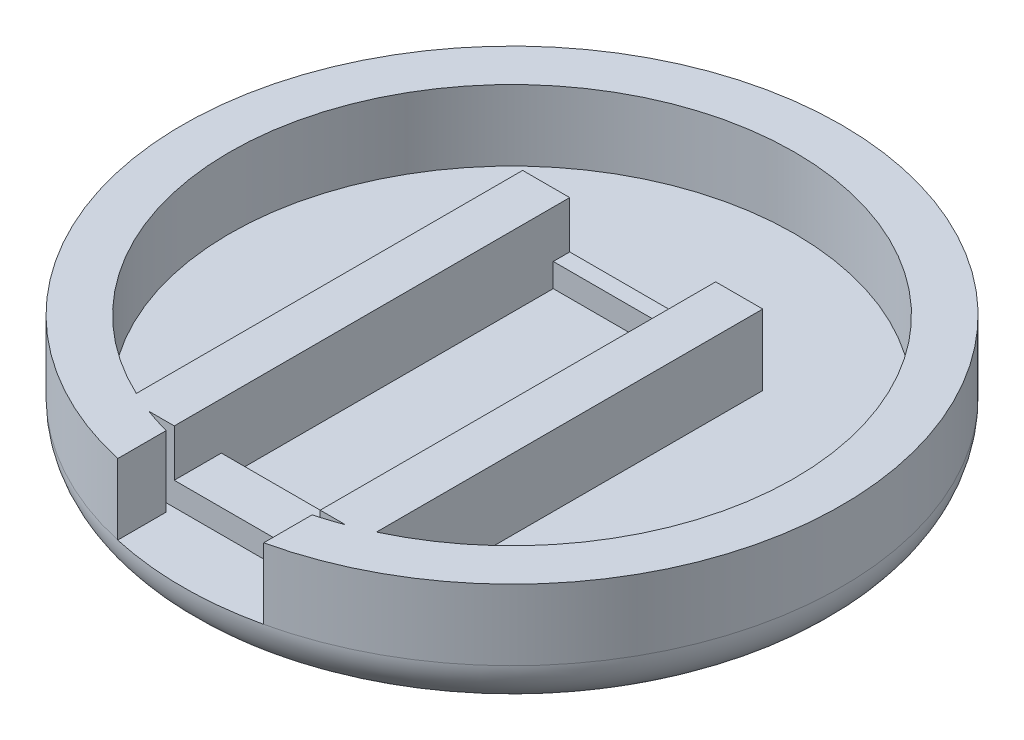
ISO-10303-21;
HEADER;
FILE_DESCRIPTION(('STEP AP214'),'2;1');
FILE_NAME('part.step','',(''),(''),'','','');
FILE_SCHEMA(('AUTOMOTIVE_DESIGN { 1 0 10303 214 1 1 1 1 }'));
ENDSEC;
DATA;
#1=APPLICATION_CONTEXT('core data for automotive mechanical design processes');
#2=APPLICATION_PROTOCOL_DEFINITION('international standard','automotive_design',2000,#1);
#3=PRODUCT_CONTEXT('',#1,'mechanical');
#4=PRODUCT('Part','Part','',(#3));
#5=PRODUCT_RELATED_PRODUCT_CATEGORY('part','',(#4));
#6=PRODUCT_DEFINITION_FORMATION('','',#4);
#7=PRODUCT_DEFINITION_CONTEXT('part definition',#1,'design');
#8=PRODUCT_DEFINITION('design','',#6,#7);
#9=PRODUCT_DEFINITION_SHAPE('','',#8);
#10=(LENGTH_UNIT() NAMED_UNIT(*) SI_UNIT(.MILLI.,.METRE.));
#11=(NAMED_UNIT(*) PLANE_ANGLE_UNIT() SI_UNIT($,.RADIAN.));
#12=(NAMED_UNIT(*) SI_UNIT($,.STERADIAN.) SOLID_ANGLE_UNIT());
#13=UNCERTAINTY_MEASURE_WITH_UNIT(LENGTH_MEASURE(1.E-05),#10,'distance_accuracy_value','');
#14=(GEOMETRIC_REPRESENTATION_CONTEXT(3) GLOBAL_UNCERTAINTY_ASSIGNED_CONTEXT((#13)) GLOBAL_UNIT_ASSIGNED_CONTEXT((#10,
#11,#12)) REPRESENTATION_CONTEXT('',''));
#15=CARTESIAN_POINT('',(0.,0.,0.));
#16=DIRECTION('',(0.,0.,1.));
#17=DIRECTION('',(1.,0.,0.));
#18=AXIS2_PLACEMENT_3D('',#15,#16,#17);
#19=CARTESIAN_POINT('',(-29.6271495714285,42.5979797464467,3.22224528571427));
#20=DIRECTION('',(0.,-1.,0.));
#21=DIRECTION('',(0.,0.,-1.));
#22=AXIS2_PLACEMENT_3D('',#19,#20,#21);
#23=CYLINDRICAL_SURFACE('',#22,12.);
#24=DIRECTION('',(0.,-1.,0.));
#25=VECTOR('',#24,1.);
#26=CARTESIAN_POINT('',(-32.7271495714285,42.5979797464467,14.8149153836684));
#27=LINE('',#26,#25);
#28=CARTESIAN_POINT('',(-32.7271495714285,0.,14.8149153836684));
#29=VERTEX_POINT('',#28);
#30=CARTESIAN_POINT('',(-32.7271495714285,3.,14.8149153836684));
#31=VERTEX_POINT('',#30);
#32=EDGE_CURVE('E333',#29,#31,#27,.F.);
#33=ORIENTED_EDGE('',*,*,#32,.F.);
#34=CARTESIAN_POINT('',(-29.6271495714285,0.,3.22224528571427));
#35=DIRECTION('',(0.,-1.,0.));
#36=DIRECTION('',(0.,0.,-1.));
#37=AXIS2_PLACEMENT_3D('',#34,#35,#36);
#38=CIRCLE('',#37,12.);
#39=CARTESIAN_POINT('',(-33.8038887163118,0.,14.4719052857143));
#40=VERTEX_POINT('',#39);
#41=EDGE_CURVE('E329',#40,#29,#38,.F.);
#42=ORIENTED_EDGE('',*,*,#41,.F.);
#43=DIRECTION('',(0.,-1.,0.));
#44=VECTOR('',#43,1.);
#45=CARTESIAN_POINT('',(-33.8038887163118,42.5979797464467,14.4719052857143));
#46=LINE('',#45,#44);
#47=CARTESIAN_POINT('',(-33.8038887163118,3.,14.4719052857143));
#48=VERTEX_POINT('',#47);
#49=EDGE_CURVE('E194',#40,#48,#46,.F.);
#50=ORIENTED_EDGE('',*,*,#49,.T.);
#51=CARTESIAN_POINT('',(-29.6271495714285,3.,3.22224528571427));
#52=DIRECTION('',(0.,-1.,0.));
#53=DIRECTION('',(0.,0.,-1.));
#54=AXIS2_PLACEMENT_3D('',#51,#52,#53);
#55=CIRCLE('',#54,12.);
#56=EDGE_CURVE('E187',#48,#31,#55,.F.);
#57=ORIENTED_EDGE('',*,*,#56,.T.);
#58=EDGE_LOOP('',(#33,#42,#50,#57));
#59=FACE_BOUND('',#58,.T.);
#60=ADVANCED_FACE('F33',(#59),#23,.F.);
#61=DIRECTION('',(0.,-1.,0.));
#62=VECTOR('',#61,1.);
#63=CARTESIAN_POINT('',(-26.5271495714285,42.5979797464467,14.8149153836684));
#64=LINE('',#63,#62);
#65=CARTESIAN_POINT('',(-26.5271495714285,3.,14.8149153836684));
#66=VERTEX_POINT('',#65);
#67=CARTESIAN_POINT('',(-26.5271495714285,0.,14.8149153836684));
#68=VERTEX_POINT('',#67);
#69=EDGE_CURVE('E167',#66,#68,#64,.T.);
#70=ORIENTED_EDGE('',*,*,#69,.F.);
#71=CARTESIAN_POINT('',(-25.4504104265453,3.,14.4719052857143));
#72=VERTEX_POINT('',#71);
#73=EDGE_CURVE('E177',#66,#72,#55,.F.);
#74=ORIENTED_EDGE('',*,*,#73,.T.);
#75=DIRECTION('',(0.,-1.,0.));
#76=VECTOR('',#75,1.);
#77=CARTESIAN_POINT('',(-25.4504104265453,42.5979797464467,14.4719052857143));
#78=LINE('',#77,#76);
#79=CARTESIAN_POINT('',(-25.4504104265453,0.,14.4719052857143));
#80=VERTEX_POINT('',#79);
#81=EDGE_CURVE('E196',#72,#80,#78,.T.);
#82=ORIENTED_EDGE('',*,*,#81,.T.);
#83=EDGE_CURVE('E332',#68,#80,#38,.F.);
#84=ORIENTED_EDGE('',*,*,#83,.F.);
#85=EDGE_LOOP('',(#70,#74,#82,#84));
#86=FACE_BOUND('',#85,.T.);
#87=ADVANCED_FACE('F285',(#86),#23,.F.);
#88=CARTESIAN_POINT('',(0.,3.,0.));
#89=DIRECTION('',(0.,-1.,0.));
#90=DIRECTION('',(0.,0.,-1.));
#91=AXIS2_PLACEMENT_3D('',#88,#89,#90);
#92=PLANE('',#91);
#93=DIRECTION('',(0.,0.,-1.));
#94=VECTOR('',#93,1.);
#95=CARTESIAN_POINT('',(-32.7271495714285,3.,22.0919052857143));
#96=LINE('',#95,#94);
#97=CARTESIAN_POINT('',(-32.7271495714285,3.,16.8747175892936));
#98=VERTEX_POINT('',#97);
#99=EDGE_CURVE('E178',#98,#31,#96,.T.);
#100=ORIENTED_EDGE('',*,*,#99,.T.);
#101=ORIENTED_EDGE('',*,*,#56,.F.);
#102=DIRECTION('',(1.,0.,0.));
#103=VECTOR('',#102,1.);
#104=CARTESIAN_POINT('',(-24.5271495714285,3.,14.4719052857143));
#105=LINE('',#104,#103);
#106=CARTESIAN_POINT('',(-32.7271495714285,3.,14.4719052857143));
#107=VERTEX_POINT('',#106);
#108=EDGE_CURVE('E259',#48,#107,#105,.T.);
#109=ORIENTED_EDGE('',*,*,#108,.T.);
#110=DIRECTION('',(0.,0.,1.));
#111=VECTOR('',#110,1.);
#112=CARTESIAN_POINT('',(-32.7271495714285,3.,-1.62809471428573));
#113=LINE('',#112,#111);
#114=CARTESIAN_POINT('',(-32.7271495714285,3.,-2.32809471428573));
#115=VERTEX_POINT('',#114);
#116=EDGE_CURVE('E230',#115,#107,#113,.T.);
#117=ORIENTED_EDGE('',*,*,#116,.F.);
#118=DIRECTION('',(-1.,0.,0.));
#119=VECTOR('',#118,1.);
#120=CARTESIAN_POINT('',(-34.7271495714285,3.,-2.32809471428573));
#121=LINE('',#120,#119);
#122=CARTESIAN_POINT('',(-34.7271495714285,3.,-2.32809471428573));
#123=VERTEX_POINT('',#122);
#124=EDGE_CURVE('E263',#115,#123,#121,.T.);
#125=ORIENTED_EDGE('',*,*,#124,.T.);
#126=DIRECTION('',(0.,0.,1.));
#127=VECTOR('',#126,1.);
#128=CARTESIAN_POINT('',(-34.7271495714285,3.,14.4719052857143));
#129=LINE('',#128,#127);
#130=CARTESIAN_POINT('',(-34.7271495714285,3.,14.0845654798533));
#131=VERTEX_POINT('',#130);
#132=EDGE_CURVE('E255',#123,#131,#129,.T.);
#133=ORIENTED_EDGE('',*,*,#132,.T.);
#134=CARTESIAN_POINT('',(-24.5271495714285,3.,14.0845654798533));
#135=VERTEX_POINT('',#134);
#136=EDGE_CURVE('E184',#135,#131,#55,.F.);
#137=ORIENTED_EDGE('',*,*,#136,.F.);
#138=DIRECTION('',(0.,0.,-1.));
#139=VECTOR('',#138,1.);
#140=CARTESIAN_POINT('',(-24.5271495714285,3.,-2.32809471428573));
#141=LINE('',#140,#139);
#142=CARTESIAN_POINT('',(-24.5271495714285,3.,-2.32809471428573));
#143=VERTEX_POINT('',#142);
#144=EDGE_CURVE('E261',#135,#143,#141,.T.);
#145=ORIENTED_EDGE('',*,*,#144,.T.);
#146=CARTESIAN_POINT('',(-26.5271495714285,3.,-2.32809471428573));
#147=VERTEX_POINT('',#146);
#148=EDGE_CURVE('E264',#143,#147,#121,.T.);
#149=ORIENTED_EDGE('',*,*,#148,.T.);
#150=DIRECTION('',(0.,0.,-1.));
#151=VECTOR('',#150,1.);
#152=CARTESIAN_POINT('',(-26.5271495714285,3.,12.4719052857143));
#153=LINE('',#152,#151);
#154=CARTESIAN_POINT('',(-26.5271495714285,3.,14.4719052857143));
#155=VERTEX_POINT('',#154);
#156=EDGE_CURVE('E233',#155,#147,#153,.T.);
#157=ORIENTED_EDGE('',*,*,#156,.F.);
#158=EDGE_CURVE('E258',#155,#72,#105,.T.);
#159=ORIENTED_EDGE('',*,*,#158,.T.);
#160=ORIENTED_EDGE('',*,*,#73,.F.);
#161=DIRECTION('',(0.,0.,-1.));
#162=VECTOR('',#161,1.);
#163=CARTESIAN_POINT('',(-26.5271495714285,3.,22.0919052857143));
#164=LINE('',#163,#162);
#165=CARTESIAN_POINT('',(-26.5271495714285,3.,16.8747175892936));
#166=VERTEX_POINT('',#165);
#167=EDGE_CURVE('E160',#166,#66,#164,.T.);
#168=ORIENTED_EDGE('',*,*,#167,.F.);
#169=CARTESIAN_POINT('',(-29.6271495714285,3.,3.22224528571427));
#170=DIRECTION('',(0.,-1.,0.));
#171=DIRECTION('',(0.,0.,-1.));
#172=AXIS2_PLACEMENT_3D('',#169,#170,#171);
#173=CIRCLE('',#172,14.);
#174=EDGE_CURVE('E175',#166,#98,#173,.F.);
#175=ORIENTED_EDGE('',*,*,#174,.T.);
#176=EDGE_LOOP('',(#100,#101,#109,#117,#125,#133,#137,#145,#149,#157,#159,#160,#168,#175));
#177=FACE_BOUND('',#176,.T.);
#178=ADVANCED_FACE('F174',(#177),#92,.F.);
#179=CARTESIAN_POINT('',(-29.6271495714285,42.5979797464467,3.22224528571427));
#180=DIRECTION('',(0.,-1.,0.));
#181=DIRECTION('',(0.,0.,-1.));
#182=AXIS2_PLACEMENT_3D('',#179,#180,#181);
#183=CYLINDRICAL_SURFACE('',#182,14.);
#184=DIRECTION('',(0.,-1.,0.));
#185=VECTOR('',#184,1.);
#186=CARTESIAN_POINT('',(-26.5271495714285,42.5979797464467,16.8747175892936));
#187=LINE('',#186,#185);
#188=CARTESIAN_POINT('',(-26.5271495714285,0.,16.8747175892936));
#189=VERTEX_POINT('',#188);
#190=EDGE_CURVE('E157',#166,#189,#187,.T.);
#191=ORIENTED_EDGE('',*,*,#190,.T.);
#192=CARTESIAN_POINT('',(-29.6271495714285,0.,3.22224528571427));
#193=DIRECTION('',(0.,-1.,0.));
#194=DIRECTION('',(0.,0.,-1.));
#195=AXIS2_PLACEMENT_3D('',#192,#193,#194);
#196=CIRCLE('',#195,14.);
#197=CARTESIAN_POINT('',(-32.7271495714285,0.,16.8747175892936));
#198=VERTEX_POINT('',#197);
#199=EDGE_CURVE('E11',#189,#198,#196,.F.);
#200=ORIENTED_EDGE('',*,*,#199,.T.);
#201=DIRECTION('',(0.,-1.,0.));
#202=VECTOR('',#201,1.);
#203=CARTESIAN_POINT('',(-32.7271495714285,42.5979797464467,16.8747175892936));
#204=LINE('',#203,#202);
#205=EDGE_CURVE('E183',#198,#98,#204,.F.);
#206=ORIENTED_EDGE('',*,*,#205,.T.);
#207=ORIENTED_EDGE('',*,*,#174,.F.);
#208=EDGE_LOOP('',(#191,#200,#206,#207));
#209=FACE_BOUND('',#208,.T.);
#210=ADVANCED_FACE('F181',(#209),#183,.T.);
#211=CARTESIAN_POINT('',(-34.7271495714285,3.,14.4719052857143));
#212=DIRECTION('',(1.,0.,0.));
#213=DIRECTION('',(0.,0.,-1.));
#214=AXIS2_PLACEMENT_3D('',#211,#212,#213);
#215=PLANE('',#214);
#216=DIRECTION('',(0.,0.,-1.));
#217=VECTOR('',#216,1.);
#218=CARTESIAN_POINT('',(-34.7271495714285,0.,14.4719052857143));
#219=LINE('',#218,#217);
#220=CARTESIAN_POINT('',(-34.7271495714285,0.,14.0845654798533));
#221=VERTEX_POINT('',#220);
#222=CARTESIAN_POINT('',(-34.7271495714285,0.,-2.32809471428573));
#223=VERTEX_POINT('',#222);
#224=EDGE_CURVE('E188',#221,#223,#219,.T.);
#225=ORIENTED_EDGE('',*,*,#224,.F.);
#226=DIRECTION('',(0.,-1.,0.));
#227=VECTOR('',#226,1.);
#228=CARTESIAN_POINT('',(-34.7271495714285,42.5979797464467,14.0845654798533));
#229=LINE('',#228,#227);
#230=EDGE_CURVE('E199',#131,#221,#229,.T.);
#231=ORIENTED_EDGE('',*,*,#230,.F.);
#232=ORIENTED_EDGE('',*,*,#132,.F.);
#233=DIRECTION('',(0.,-1.,0.));
#234=VECTOR('',#233,1.);
#235=CARTESIAN_POINT('',(-34.7271495714285,3.,-2.32809471428573));
#236=LINE('',#235,#234);
#237=EDGE_CURVE('E267',#123,#223,#236,.T.);
#238=ORIENTED_EDGE('',*,*,#237,.T.);
#239=EDGE_LOOP('',(#225,#231,#232,#238));
#240=FACE_BOUND('',#239,.T.);
#241=ADVANCED_FACE('F370',(#240),#215,.F.);
#242=CARTESIAN_POINT('',(-24.5271495714285,3.,14.4719052857143));
#243=DIRECTION('',(0.,0.,-1.));
#244=DIRECTION('',(-1.,0.,0.));
#245=AXIS2_PLACEMENT_3D('',#242,#243,#244);
#246=PLANE('',#245);
#247=DIRECTION('',(1.,0.,0.));
#248=VECTOR('',#247,1.);
#249=CARTESIAN_POINT('',(-32.7271495714285,1.,14.4719052857143));
#250=LINE('',#249,#248);
#251=CARTESIAN_POINT('',(-32.7271495714285,1.,14.4719052857143));
#252=VERTEX_POINT('',#251);
#253=CARTESIAN_POINT('',(-26.5271495714285,1.,14.4719052857143));
#254=VERTEX_POINT('',#253);
#255=EDGE_CURVE('E204',#252,#254,#250,.T.);
#256=ORIENTED_EDGE('',*,*,#255,.F.);
#257=DIRECTION('',(0.,-1.,0.));
#258=VECTOR('',#257,1.);
#259=CARTESIAN_POINT('',(-32.7271495714285,3.,14.4719052857143));
#260=LINE('',#259,#258);
#261=EDGE_CURVE('E201',#107,#252,#260,.T.);
#262=ORIENTED_EDGE('',*,*,#261,.F.);
#263=ORIENTED_EDGE('',*,*,#108,.F.);
#264=ORIENTED_EDGE('',*,*,#49,.F.);
#265=DIRECTION('',(-1.,0.,0.));
#266=VECTOR('',#265,1.);
#267=CARTESIAN_POINT('',(-24.5271495714285,0.,14.4719052857143));
#268=LINE('',#267,#266);
#269=EDGE_CURVE('E320',#80,#40,#268,.T.);
#270=ORIENTED_EDGE('',*,*,#269,.F.);
#271=ORIENTED_EDGE('',*,*,#81,.F.);
#272=ORIENTED_EDGE('',*,*,#158,.F.);
#273=DIRECTION('',(0.,1.,0.));
#274=VECTOR('',#273,1.);
#275=CARTESIAN_POINT('',(-26.5271495714285,3.,14.4719052857143));
#276=LINE('',#275,#274);
#277=EDGE_CURVE('E207',#254,#155,#276,.T.);
#278=ORIENTED_EDGE('',*,*,#277,.F.);
#279=EDGE_LOOP('',(#256,#262,#263,#264,#270,#271,#272,#278));
#280=FACE_BOUND('',#279,.T.);
#281=ADVANCED_FACE('F351',(#280),#246,.F.);
#282=CARTESIAN_POINT('',(-24.5271495714285,3.,-2.32809471428573));
#283=DIRECTION('',(-1.,0.,0.));
#284=DIRECTION('',(0.,0.,1.));
#285=AXIS2_PLACEMENT_3D('',#282,#283,#284);
#286=PLANE('',#285);
#287=DIRECTION('',(0.,0.,1.));
#288=VECTOR('',#287,1.);
#289=CARTESIAN_POINT('',(-24.5271495714285,0.,-2.32809471428573));
#290=LINE('',#289,#288);
#291=CARTESIAN_POINT('',(-24.5271495714285,0.,-2.32809471428573));
#292=VERTEX_POINT('',#291);
#293=CARTESIAN_POINT('',(-24.5271495714285,0.,14.0845654798533));
#294=VERTEX_POINT('',#293);
#295=EDGE_CURVE('E319',#292,#294,#290,.T.);
#296=ORIENTED_EDGE('',*,*,#295,.F.);
#297=DIRECTION('',(0.,-1.,0.));
#298=VECTOR('',#297,1.);
#299=CARTESIAN_POINT('',(-24.5271495714285,3.,-2.32809471428573));
#300=LINE('',#299,#298);
#301=EDGE_CURVE('E269',#143,#292,#300,.T.);
#302=ORIENTED_EDGE('',*,*,#301,.F.);
#303=ORIENTED_EDGE('',*,*,#144,.F.);
#304=DIRECTION('',(0.,-1.,0.));
#305=VECTOR('',#304,1.);
#306=CARTESIAN_POINT('',(-24.5271495714285,42.5979797464467,14.0845654798533));
#307=LINE('',#306,#305);
#308=EDGE_CURVE('E192',#294,#135,#307,.F.);
#309=ORIENTED_EDGE('',*,*,#308,.F.);
#310=EDGE_LOOP('',(#296,#302,#303,#309));
#311=FACE_BOUND('',#310,.T.);
#312=ADVANCED_FACE('F308',(#311),#286,.F.);
#313=CARTESIAN_POINT('',(-34.7271495714285,3.,-2.32809471428573));
#314=DIRECTION('',(0.,0.,1.));
#315=DIRECTION('',(1.,0.,0.));
#316=AXIS2_PLACEMENT_3D('',#313,#314,#315);
#317=PLANE('',#316);
#318=DIRECTION('',(1.,0.,0.));
#319=VECTOR('',#318,1.);
#320=CARTESIAN_POINT('',(-34.7271495714285,0.,-2.32809471428573));
#321=LINE('',#320,#319);
#322=EDGE_CURVE('E53',#223,#292,#321,.T.);
#323=ORIENTED_EDGE('',*,*,#322,.F.);
#324=ORIENTED_EDGE('',*,*,#237,.F.);
#325=ORIENTED_EDGE('',*,*,#124,.F.);
#326=DIRECTION('',(0.,-1.,0.));
#327=VECTOR('',#326,1.);
#328=CARTESIAN_POINT('',(-32.7271495714285,3.,-2.32809471428573));
#329=LINE('',#328,#327);
#330=CARTESIAN_POINT('',(-32.7271495714285,1.,-2.32809471428573));
#331=VERTEX_POINT('',#330);
#332=EDGE_CURVE('E226',#115,#331,#329,.T.);
#333=ORIENTED_EDGE('',*,*,#332,.T.);
#334=DIRECTION('',(1.,0.,0.));
#335=VECTOR('',#334,1.);
#336=CARTESIAN_POINT('',(-34.7271495714285,1.,-2.32809471428573));
#337=LINE('',#336,#335);
#338=CARTESIAN_POINT('',(-26.5271495714285,1.,-2.32809471428573));
#339=VERTEX_POINT('',#338);
#340=EDGE_CURVE('E220',#331,#339,#337,.T.);
#341=ORIENTED_EDGE('',*,*,#340,.T.);
#342=DIRECTION('',(0.,1.,0.));
#343=VECTOR('',#342,1.);
#344=CARTESIAN_POINT('',(-26.5271495714285,3.,-2.32809471428573));
#345=LINE('',#344,#343);
#346=EDGE_CURVE('E223',#339,#147,#345,.T.);
#347=ORIENTED_EDGE('',*,*,#346,.T.);
#348=ORIENTED_EDGE('',*,*,#148,.F.);
#349=ORIENTED_EDGE('',*,*,#301,.T.);
#350=EDGE_LOOP('',(#323,#324,#325,#333,#341,#347,#348,#349));
#351=FACE_BOUND('',#350,.T.);
#352=ADVANCED_FACE('F299',(#351),#317,.F.);
#353=CARTESIAN_POINT('',(-29.6271495714285,0.,3.22224528571427));
#354=DIRECTION('',(0.,-1.,0.));
#355=DIRECTION('',(0.,0.,-1.));
#356=AXIS2_PLACEMENT_3D('',#353,#354,#355);
#357=CIRCLE('',#356,12.);
#358=EDGE_CURVE('E311',#294,#221,#357,.F.);
#359=ORIENTED_EDGE('',*,*,#358,.F.);
#360=ORIENTED_EDGE('',*,*,#308,.T.);
#361=ORIENTED_EDGE('',*,*,#136,.T.);
#362=ORIENTED_EDGE('',*,*,#230,.T.);
#363=EDGE_LOOP('',(#359,#360,#361,#362));
#364=FACE_BOUND('',#363,.T.);
#365=ADVANCED_FACE('F288',(#364),#23,.F.);
#366=CARTESIAN_POINT('',(-26.5271495714285,3.,-1.62809471428573));
#367=DIRECTION('',(0.,0.,1.));
#368=DIRECTION('',(1.,0.,0.));
#369=AXIS2_PLACEMENT_3D('',#366,#367,#368);
#370=PLANE('',#369);
#371=DIRECTION('',(1.,0.,0.));
#372=VECTOR('',#371,1.);
#373=CARTESIAN_POINT('',(-26.5271495714285,1.,-1.62809471428573));
#374=LINE('',#373,#372);
#375=CARTESIAN_POINT('',(-32.7271495714285,1.,-1.62809471428573));
#376=VERTEX_POINT('',#375);
#377=CARTESIAN_POINT('',(-26.5271495714285,1.,-1.62809471428573));
#378=VERTEX_POINT('',#377);
#379=EDGE_CURVE('E218',#376,#378,#374,.T.);
#380=ORIENTED_EDGE('',*,*,#379,.F.);
#381=DIRECTION('',(0.,-1.,0.));
#382=VECTOR('',#381,1.);
#383=CARTESIAN_POINT('',(-32.7271495714285,3.,-1.62809471428573));
#384=LINE('',#383,#382);
#385=CARTESIAN_POINT('',(-32.7271495714285,0.,-1.62809471428573));
#386=VERTEX_POINT('',#385);
#387=EDGE_CURVE('E253',#376,#386,#384,.T.);
#388=ORIENTED_EDGE('',*,*,#387,.T.);
#389=DIRECTION('',(-1.,0.,0.));
#390=VECTOR('',#389,1.);
#391=CARTESIAN_POINT('',(-26.5271495714285,0.,-1.62809471428573));
#392=LINE('',#391,#390);
#393=CARTESIAN_POINT('',(-26.5271495714285,0.,-1.62809471428573));
#394=VERTEX_POINT('',#393);
#395=EDGE_CURVE('E229',#394,#386,#392,.T.);
#396=ORIENTED_EDGE('',*,*,#395,.F.);
#397=DIRECTION('',(0.,-1.,0.));
#398=VECTOR('',#397,1.);
#399=CARTESIAN_POINT('',(-26.5271495714285,3.,-1.62809471428573));
#400=LINE('',#399,#398);
#401=EDGE_CURVE('E236',#378,#394,#400,.T.);
#402=ORIENTED_EDGE('',*,*,#401,.F.);
#403=EDGE_LOOP('',(#380,#388,#396,#402));
#404=FACE_BOUND('',#403,.T.);
#405=ADVANCED_FACE('F298',(#404),#370,.T.);
#406=CARTESIAN_POINT('',(-32.7271495714285,3.,-1.62809471428573));
#407=DIRECTION('',(1.,0.,0.));
#408=DIRECTION('',(0.,0.,-1.));
#409=AXIS2_PLACEMENT_3D('',#406,#407,#408);
#410=PLANE('',#409);
#411=ORIENTED_EDGE('',*,*,#387,.F.);
#412=DIRECTION('',(0.,0.,1.));
#413=VECTOR('',#412,1.);
#414=CARTESIAN_POINT('',(-32.7271495714285,1.,-10.9280947142857));
#415=LINE('',#414,#413);
#416=EDGE_CURVE('E214',#331,#376,#415,.T.);
#417=ORIENTED_EDGE('',*,*,#416,.F.);
#418=ORIENTED_EDGE('',*,*,#332,.F.);
#419=ORIENTED_EDGE('',*,*,#116,.T.);
#420=ORIENTED_EDGE('',*,*,#261,.T.);
#421=CARTESIAN_POINT('',(-32.7271495714285,1.,12.4719052857143));
#422=VERTEX_POINT('',#421);
#423=EDGE_CURVE('E210',#422,#252,#415,.T.);
#424=ORIENTED_EDGE('',*,*,#423,.F.);
#425=DIRECTION('',(0.,-1.,0.));
#426=VECTOR('',#425,1.);
#427=CARTESIAN_POINT('',(-32.7271495714285,3.,12.4719052857143));
#428=LINE('',#427,#426);
#429=CARTESIAN_POINT('',(-32.7271495714285,0.,12.4719052857143));
#430=VERTEX_POINT('',#429);
#431=EDGE_CURVE('E251',#422,#430,#428,.T.);
#432=ORIENTED_EDGE('',*,*,#431,.T.);
#433=DIRECTION('',(0.,0.,1.));
#434=VECTOR('',#433,1.);
#435=CARTESIAN_POINT('',(-32.7271495714285,0.,-1.62809471428573));
#436=LINE('',#435,#434);
#437=EDGE_CURVE('E239',#386,#430,#436,.T.);
#438=ORIENTED_EDGE('',*,*,#437,.F.);
#439=EDGE_LOOP('',(#411,#417,#418,#419,#420,#424,#432,#438));
#440=FACE_BOUND('',#439,.T.);
#441=ADVANCED_FACE('F305',(#440),#410,.T.);
#442=CARTESIAN_POINT('',(-32.7271495714285,3.,12.4719052857143));
#443=DIRECTION('',(0.,0.,-1.));
#444=DIRECTION('',(-1.,0.,0.));
#445=AXIS2_PLACEMENT_3D('',#442,#443,#444);
#446=PLANE('',#445);
#447=DIRECTION('',(-1.,0.,0.));
#448=VECTOR('',#447,1.);
#449=CARTESIAN_POINT('',(-32.7271495714285,1.,12.4719052857143));
#450=LINE('',#449,#448);
#451=CARTESIAN_POINT('',(-26.5271495714285,1.,12.4719052857143));
#452=VERTEX_POINT('',#451);
#453=EDGE_CURVE('E216',#452,#422,#450,.T.);
#454=ORIENTED_EDGE('',*,*,#453,.F.);
#455=DIRECTION('',(0.,-1.,0.));
#456=VECTOR('',#455,1.);
#457=CARTESIAN_POINT('',(-26.5271495714285,3.,12.4719052857143));
#458=LINE('',#457,#456);
#459=CARTESIAN_POINT('',(-26.5271495714285,0.,12.4719052857143));
#460=VERTEX_POINT('',#459);
#461=EDGE_CURVE('E248',#452,#460,#458,.T.);
#462=ORIENTED_EDGE('',*,*,#461,.T.);
#463=DIRECTION('',(1.,0.,0.));
#464=VECTOR('',#463,1.);
#465=CARTESIAN_POINT('',(-32.7271495714285,0.,12.4719052857143));
#466=LINE('',#465,#464);
#467=EDGE_CURVE('E242',#430,#460,#466,.T.);
#468=ORIENTED_EDGE('',*,*,#467,.F.);
#469=ORIENTED_EDGE('',*,*,#431,.F.);
#470=EDGE_LOOP('',(#454,#462,#468,#469));
#471=FACE_BOUND('',#470,.T.);
#472=ADVANCED_FACE('F385',(#471),#446,.T.);
#473=CARTESIAN_POINT('',(-26.5271495714285,3.,12.4719052857143));
#474=DIRECTION('',(-1.,0.,0.));
#475=DIRECTION('',(0.,0.,1.));
#476=AXIS2_PLACEMENT_3D('',#473,#474,#475);
#477=PLANE('',#476);
#478=ORIENTED_EDGE('',*,*,#461,.F.);
#479=DIRECTION('',(0.,0.,1.));
#480=VECTOR('',#479,1.);
#481=CARTESIAN_POINT('',(-26.5271495714285,1.,-10.9280947142857));
#482=LINE('',#481,#480);
#483=EDGE_CURVE('E211',#452,#254,#482,.T.);
#484=ORIENTED_EDGE('',*,*,#483,.T.);
#485=ORIENTED_EDGE('',*,*,#277,.T.);
#486=ORIENTED_EDGE('',*,*,#156,.T.);
#487=ORIENTED_EDGE('',*,*,#346,.F.);
#488=EDGE_CURVE('E213',#339,#378,#482,.T.);
#489=ORIENTED_EDGE('',*,*,#488,.T.);
#490=ORIENTED_EDGE('',*,*,#401,.T.);
#491=DIRECTION('',(0.,0.,-1.));
#492=VECTOR('',#491,1.);
#493=CARTESIAN_POINT('',(-26.5271495714285,0.,12.4719052857143));
#494=LINE('',#493,#492);
#495=EDGE_CURVE('E234',#460,#394,#494,.T.);
#496=ORIENTED_EDGE('',*,*,#495,.F.);
#497=EDGE_LOOP('',(#478,#484,#485,#486,#487,#489,#490,#496));
#498=FACE_BOUND('',#497,.T.);
#499=ADVANCED_FACE('F356',(#498),#477,.T.);
#500=CARTESIAN_POINT('',(-32.7271495714285,1.,-10.9280947142857));
#501=DIRECTION('',(0.,-1.,0.));
#502=DIRECTION('',(0.,0.,-1.));
#503=AXIS2_PLACEMENT_3D('',#500,#501,#502);
#504=PLANE('',#503);
#505=ORIENTED_EDGE('',*,*,#453,.T.);
#506=ORIENTED_EDGE('',*,*,#423,.T.);
#507=ORIENTED_EDGE('',*,*,#255,.T.);
#508=ORIENTED_EDGE('',*,*,#483,.F.);
#509=EDGE_LOOP('',(#505,#506,#507,#508));
#510=FACE_BOUND('',#509,.T.);
#511=ADVANCED_FACE('F359',(#510),#504,.F.);
#512=ORIENTED_EDGE('',*,*,#416,.T.);
#513=ORIENTED_EDGE('',*,*,#379,.T.);
#514=ORIENTED_EDGE('',*,*,#488,.F.);
#515=ORIENTED_EDGE('',*,*,#340,.F.);
#516=EDGE_LOOP('',(#512,#513,#514,#515));
#517=FACE_BOUND('',#516,.T.);
#518=ADVANCED_FACE('F393',(#517),#504,.F.);
#519=CARTESIAN_POINT('',(0.,0.,0.));
#520=DIRECTION('',(0.,-1.,0.));
#521=DIRECTION('',(0.,0.,-1.));
#522=AXIS2_PLACEMENT_3D('',#519,#520,#521);
#523=PLANE('',#522);
#524=ORIENTED_EDGE('',*,*,#467,.T.);
#525=ORIENTED_EDGE('',*,*,#495,.T.);
#526=ORIENTED_EDGE('',*,*,#395,.T.);
#527=ORIENTED_EDGE('',*,*,#437,.T.);
#528=EDGE_LOOP('',(#524,#525,#526,#527));
#529=FACE_BOUND('',#528,.T.);
#530=ADVANCED_FACE('F394',(#529),#523,.F.);
#531=CARTESIAN_POINT('',(0.,-2.,0.));
#532=DIRECTION('',(0.,-1.,0.));
#533=DIRECTION('',(0.,0.,-1.));
#534=AXIS2_PLACEMENT_3D('',#531,#532,#533);
#535=PLANE('',#534);
#536=CARTESIAN_POINT('',(-29.6271495714285,-2.,3.22224528571427));
#537=DIRECTION('',(0.,-1.,0.));
#538=DIRECTION('',(0.,0.,-1.));
#539=AXIS2_PLACEMENT_3D('',#536,#537,#538);
#540=CIRCLE('',#539,12.);
#541=CARTESIAN_POINT('',(-29.6271495714285,-2.,-8.77775471428574));
#542=VERTEX_POINT('',#541);
#543=EDGE_CURVE('E41',#542,#542,#540,.T.);
#544=ORIENTED_EDGE('',*,*,#543,.T.);
#545=EDGE_LOOP('',(#544));
#546=FACE_BOUND('',#545,.T.);
#547=ADVANCED_FACE('F275',(#546),#535,.T.);
#548=CARTESIAN_POINT('',(-29.6271495714285,0.,3.22224528571427));
#549=DIRECTION('',(0.,-1.,0.));
#550=DIRECTION('',(0.,0.,-1.));
#551=AXIS2_PLACEMENT_3D('',#548,#549,#550);
#552=PLANE('',#551);
#553=ORIENTED_EDGE('',*,*,#269,.T.);
#554=ORIENTED_EDGE('',*,*,#41,.T.);
#555=DIRECTION('',(0.,0.,-1.));
#556=VECTOR('',#555,1.);
#557=CARTESIAN_POINT('',(-32.7271495714285,0.,22.0919052857143));
#558=LINE('',#557,#556);
#559=EDGE_CURVE('E168',#198,#29,#558,.T.);
#560=ORIENTED_EDGE('',*,*,#559,.F.);
#561=CARTESIAN_POINT('',(-29.6271495714285,0.,3.22224528571427));
#562=DIRECTION('',(0.,1.,0.));
#563=DIRECTION('',(0.,0.,1.));
#564=AXIS2_PLACEMENT_3D('',#561,#562,#563);
#565=CIRCLE('',#564,14.);
#566=EDGE_CURVE('E271',#189,#198,#565,.F.);
#567=ORIENTED_EDGE('',*,*,#566,.F.);
#568=DIRECTION('',(0.,0.,-1.));
#569=VECTOR('',#568,1.);
#570=CARTESIAN_POINT('',(-26.5271495714285,0.,22.0919052857143));
#571=LINE('',#570,#569);
#572=EDGE_CURVE('E163',#189,#68,#571,.T.);
#573=ORIENTED_EDGE('',*,*,#572,.T.);
#574=ORIENTED_EDGE('',*,*,#83,.T.);
#575=EDGE_LOOP('',(#553,#554,#560,#567,#573,#574));
#576=FACE_BOUND('',#575,.T.);
#577=ADVANCED_FACE('F399',(#576),#552,.F.);
#578=ORIENTED_EDGE('',*,*,#224,.T.);
#579=ORIENTED_EDGE('',*,*,#322,.T.);
#580=ORIENTED_EDGE('',*,*,#295,.T.);
#581=ORIENTED_EDGE('',*,*,#358,.T.);
#582=EDGE_LOOP('',(#578,#579,#580,#581));
#583=FACE_BOUND('',#582,.T.);
#584=ADVANCED_FACE('F325',(#583),#552,.F.);
#585=CARTESIAN_POINT('',(-32.7271495714285,3.,22.0919052857143));
#586=DIRECTION('',(1.,0.,0.));
#587=DIRECTION('',(0.,0.,-1.));
#588=AXIS2_PLACEMENT_3D('',#585,#586,#587);
#589=PLANE('',#588);
#590=ORIENTED_EDGE('',*,*,#32,.T.);
#591=ORIENTED_EDGE('',*,*,#99,.F.);
#592=ORIENTED_EDGE('',*,*,#205,.F.);
#593=ORIENTED_EDGE('',*,*,#559,.T.);
#594=EDGE_LOOP('',(#590,#591,#592,#593));
#595=FACE_BOUND('',#594,.T.);
#596=ADVANCED_FACE('F282',(#595),#589,.T.);
#597=CARTESIAN_POINT('',(-26.5271495714285,3.,22.0919052857143));
#598=DIRECTION('',(-1.,0.,0.));
#599=DIRECTION('',(0.,0.,1.));
#600=AXIS2_PLACEMENT_3D('',#597,#598,#599);
#601=PLANE('',#600);
#602=ORIENTED_EDGE('',*,*,#69,.T.);
#603=ORIENTED_EDGE('',*,*,#572,.F.);
#604=ORIENTED_EDGE('',*,*,#190,.F.);
#605=ORIENTED_EDGE('',*,*,#167,.T.);
#606=EDGE_LOOP('',(#602,#603,#604,#605));
#607=FACE_BOUND('',#606,.T.);
#608=ADVANCED_FACE('F159',(#607),#601,.T.);
#609=CARTESIAN_POINT('',(-29.6271495714285,0.,3.22224528571427));
#610=DIRECTION('',(0.,-1.,0.));
#611=DIRECTION('',(0.,0.,-1.));
#612=AXIS2_PLACEMENT_3D('',#609,#610,#611);
#613=TOROIDAL_SURFACE('',#612,12.,2.);
#614=ORIENTED_EDGE('',*,*,#199,.F.);
#615=ORIENTED_EDGE('',*,*,#566,.T.);
#616=EDGE_LOOP('',(#614,#615));
#617=FACE_BOUND('',#616,.T.);
#618=ORIENTED_EDGE('',*,*,#543,.F.);
#619=EDGE_LOOP('',(#618));
#620=FACE_BOUND('',#619,.T.);
#621=ADVANCED_FACE('F35',(#617,#620),#613,.T.);
#622=CLOSED_SHELL('',(#60,#87,#178,#210,#241,#281,#312,#352,#365,#405,#441,#472,#499,#511,#518,
#530,#547,#577,#584,#596,#608,#621));
#623=MANIFOLD_SOLID_BREP('B2',#622);
#624=ADVANCED_BREP_SHAPE_REPRESENTATION('',(#18,#623),#14);
#625=SHAPE_DEFINITION_REPRESENTATION(#9,#624);
ENDSEC;
END-ISO-10303-21;
